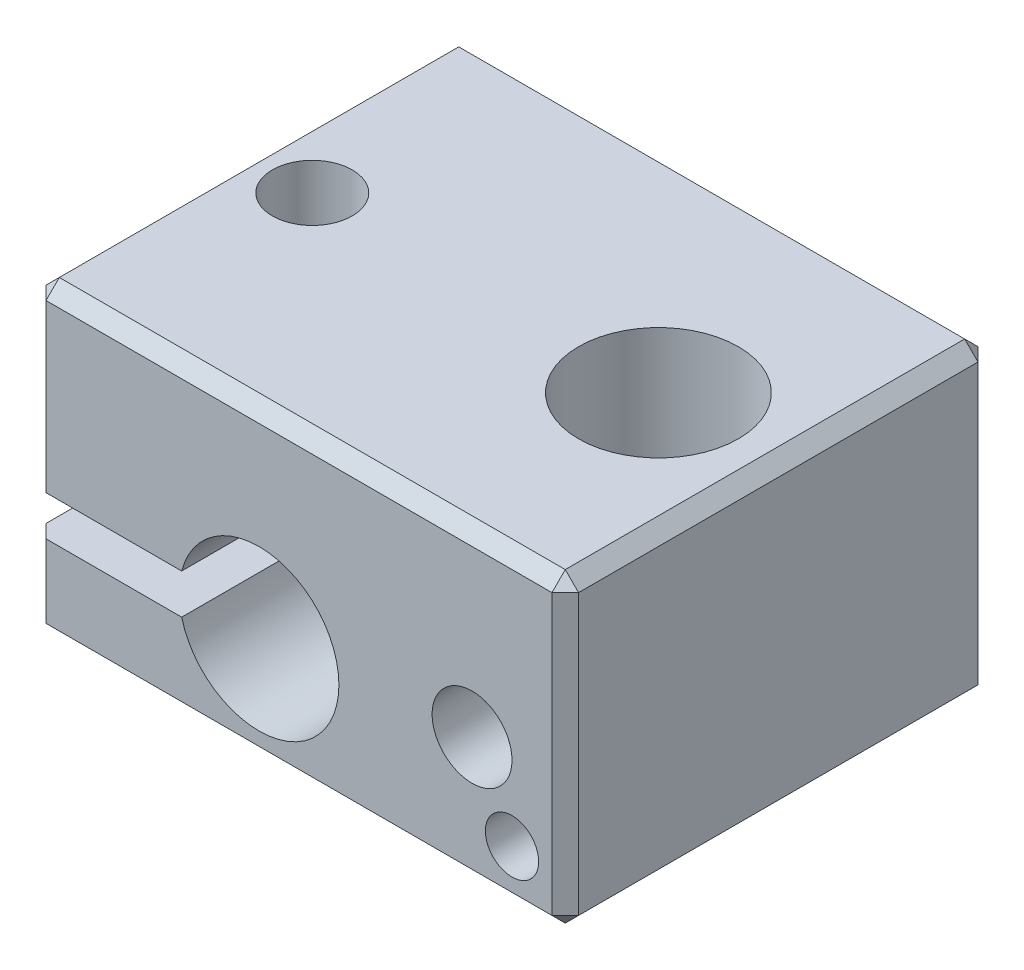
ISO-10303-21;
HEADER;
FILE_DESCRIPTION(('STEP AP214'),'2;1');
FILE_NAME('part.step','',(''),(''),'','','');
FILE_SCHEMA(('AUTOMOTIVE_DESIGN { 1 0 10303 214 1 1 1 1 }'));
ENDSEC;
DATA;
#1=APPLICATION_CONTEXT('core data for automotive mechanical design processes');
#2=APPLICATION_PROTOCOL_DEFINITION('international standard','automotive_design',2000,#1);
#3=PRODUCT_CONTEXT('',#1,'mechanical');
#4=PRODUCT('Part','Part','',(#3));
#5=PRODUCT_RELATED_PRODUCT_CATEGORY('part','',(#4));
#6=PRODUCT_DEFINITION_FORMATION('','',#4);
#7=PRODUCT_DEFINITION_CONTEXT('part definition',#1,'design');
#8=PRODUCT_DEFINITION('design','',#6,#7);
#9=PRODUCT_DEFINITION_SHAPE('','',#8);
#10=(LENGTH_UNIT() NAMED_UNIT(*) SI_UNIT(.MILLI.,.METRE.));
#11=(NAMED_UNIT(*) PLANE_ANGLE_UNIT() SI_UNIT($,.RADIAN.));
#12=(NAMED_UNIT(*) SI_UNIT($,.STERADIAN.) SOLID_ANGLE_UNIT());
#13=UNCERTAINTY_MEASURE_WITH_UNIT(LENGTH_MEASURE(1.E-05),#10,'distance_accuracy_value','');
#14=(GEOMETRIC_REPRESENTATION_CONTEXT(3) GLOBAL_UNCERTAINTY_ASSIGNED_CONTEXT((#13)) GLOBAL_UNIT_ASSIGNED_CONTEXT((#10,
#11,#12)) REPRESENTATION_CONTEXT('',''));
#15=CARTESIAN_POINT('',(0.,0.,0.));
#16=DIRECTION('',(0.,0.,1.));
#17=DIRECTION('',(1.,0.,0.));
#18=AXIS2_PLACEMENT_3D('',#15,#16,#17);
#19=CARTESIAN_POINT('',(-10.,11.5,8.));
#20=DIRECTION('',(1.,0.,0.));
#21=DIRECTION('',(0.,0.,-1.));
#22=AXIS2_PLACEMENT_3D('',#19,#20,#21);
#23=PLANE('',#22);
#24=DIRECTION('',(0.,0.,-1.));
#25=VECTOR('',#24,1.);
#26=CARTESIAN_POINT('',(-10.,11.,8.));
#27=LINE('',#26,#25);
#28=CARTESIAN_POINT('',(-10.,11.,7.5));
#29=VERTEX_POINT('',#28);
#30=CARTESIAN_POINT('',(-10.,11.,-7.5));
#31=VERTEX_POINT('',#30);
#32=EDGE_CURVE('E243',#29,#31,#27,.T.);
#33=ORIENTED_EDGE('',*,*,#32,.T.);
#34=DIRECTION('',(0.,-1.,0.));
#35=VECTOR('',#34,1.);
#36=CARTESIAN_POINT('',(-10.,11.5,-7.5));
#37=LINE('',#36,#35);
#38=CARTESIAN_POINT('',(-10.,4.75,-7.5));
#39=VERTEX_POINT('',#38);
#40=EDGE_CURVE('E247',#31,#39,#37,.T.);
#41=ORIENTED_EDGE('',*,*,#40,.T.);
#42=DIRECTION('',(0.,0.,1.));
#43=VECTOR('',#42,1.);
#44=CARTESIAN_POINT('',(-10.,4.75,-8.));
#45=LINE('',#44,#43);
#46=CARTESIAN_POINT('',(-10.,4.75,7.5));
#47=VERTEX_POINT('',#46);
#48=EDGE_CURVE('E194',#39,#47,#45,.T.);
#49=ORIENTED_EDGE('',*,*,#48,.T.);
#50=DIRECTION('',(0.,1.,0.));
#51=VECTOR('',#50,1.);
#52=CARTESIAN_POINT('',(-10.,11.5,7.5));
#53=LINE('',#52,#51);
#54=EDGE_CURVE('E245',#47,#29,#53,.T.);
#55=ORIENTED_EDGE('',*,*,#54,.T.);
#56=EDGE_LOOP('',(#33,#41,#49,#55));
#57=FACE_BOUND('',#56,.T.);
#58=ADVANCED_FACE('F35',(#57),#23,.F.);
#59=CARTESIAN_POINT('',(10.,11.5,8.));
#60=DIRECTION('',(-1.,0.,0.));
#61=DIRECTION('',(0.,0.,1.));
#62=AXIS2_PLACEMENT_3D('',#59,#60,#61);
#63=PLANE('',#62);
#64=DIRECTION('',(0.,0.,-1.));
#65=VECTOR('',#64,1.);
#66=CARTESIAN_POINT('',(10.,0.5,-8.));
#67=LINE('',#66,#65);
#68=CARTESIAN_POINT('',(10.,0.5,7.5));
#69=VERTEX_POINT('',#68);
#70=CARTESIAN_POINT('',(10.,0.5,-7.5));
#71=VERTEX_POINT('',#70);
#72=EDGE_CURVE('E219',#69,#71,#67,.T.);
#73=ORIENTED_EDGE('',*,*,#72,.T.);
#74=DIRECTION('',(0.,1.,0.));
#75=VECTOR('',#74,1.);
#76=CARTESIAN_POINT('',(10.,11.5,-7.5));
#77=LINE('',#76,#75);
#78=CARTESIAN_POINT('',(10.,11.,-7.5));
#79=VERTEX_POINT('',#78);
#80=EDGE_CURVE('E221',#71,#79,#77,.T.);
#81=ORIENTED_EDGE('',*,*,#80,.T.);
#82=DIRECTION('',(0.,0.,1.));
#83=VECTOR('',#82,1.);
#84=CARTESIAN_POINT('',(10.,11.,8.));
#85=LINE('',#84,#83);
#86=CARTESIAN_POINT('',(10.,11.,7.5));
#87=VERTEX_POINT('',#86);
#88=EDGE_CURVE('E217',#79,#87,#85,.T.);
#89=ORIENTED_EDGE('',*,*,#88,.T.);
#90=DIRECTION('',(0.,-1.,0.));
#91=VECTOR('',#90,1.);
#92=CARTESIAN_POINT('',(10.,11.5,7.5));
#93=LINE('',#92,#91);
#94=EDGE_CURVE('E215',#87,#69,#93,.T.);
#95=ORIENTED_EDGE('',*,*,#94,.T.);
#96=EDGE_LOOP('',(#73,#81,#89,#95));
#97=FACE_BOUND('',#96,.T.);
#98=ADVANCED_FACE('F405',(#97),#63,.F.);
#99=CARTESIAN_POINT('',(-10.,11.5,-8.));
#100=DIRECTION('',(0.,0.,1.));
#101=DIRECTION('',(1.,0.,0.));
#102=AXIS2_PLACEMENT_3D('',#99,#100,#101);
#103=PLANE('',#102);
#104=DIRECTION('',(-1.,0.,0.));
#105=VECTOR('',#104,1.);
#106=CARTESIAN_POINT('',(-10.,0.5,-8.));
#107=LINE('',#106,#105);
#108=CARTESIAN_POINT('',(9.5,0.5,-8.));
#109=VERTEX_POINT('',#108);
#110=CARTESIAN_POINT('',(-9.5,0.5,-8.));
#111=VERTEX_POINT('',#110);
#112=EDGE_CURVE('E211',#109,#111,#107,.T.);
#113=ORIENTED_EDGE('',*,*,#112,.T.);
#114=DIRECTION('',(0.,1.,0.));
#115=VECTOR('',#114,1.);
#116=CARTESIAN_POINT('',(-9.5,11.5,-8.));
#117=LINE('',#116,#115);
#118=CARTESIAN_POINT('',(-9.5,3.25,-8.));
#119=VERTEX_POINT('',#118);
#120=EDGE_CURVE('E213',#111,#119,#117,.T.);
#121=ORIENTED_EDGE('',*,*,#120,.T.);
#122=DIRECTION('',(1.,0.,0.));
#123=VECTOR('',#122,1.);
#124=CARTESIAN_POINT('',(-10.,3.25,-8.));
#125=LINE('',#124,#123);
#126=CARTESIAN_POINT('',(-4.40473750965556,3.25,-8.));
#127=VERTEX_POINT('',#126);
#128=EDGE_CURVE('E180',#119,#127,#125,.T.);
#129=ORIENTED_EDGE('',*,*,#128,.T.);
#130=CARTESIAN_POINT('',(-1.5,4.,-8.));
#131=DIRECTION('',(0.,0.,1.));
#132=DIRECTION('',(1.,0.,0.));
#133=AXIS2_PLACEMENT_3D('',#130,#131,#132);
#134=CIRCLE('',#133,3.);
#135=CARTESIAN_POINT('',(-4.40473750965556,4.75,-8.));
#136=VERTEX_POINT('',#135);
#137=EDGE_CURVE('E182',#127,#136,#134,.T.);
#138=ORIENTED_EDGE('',*,*,#137,.T.);
#139=DIRECTION('',(-1.,0.,0.));
#140=VECTOR('',#139,1.);
#141=CARTESIAN_POINT('',(-4.40473750965556,4.75,-8.));
#142=LINE('',#141,#140);
#143=CARTESIAN_POINT('',(-9.5,4.75,-8.));
#144=VERTEX_POINT('',#143);
#145=EDGE_CURVE('E186',#136,#144,#142,.T.);
#146=ORIENTED_EDGE('',*,*,#145,.T.);
#147=DIRECTION('',(0.,1.,0.));
#148=VECTOR('',#147,1.);
#149=CARTESIAN_POINT('',(-9.5,11.5,-8.));
#150=LINE('',#149,#148);
#151=CARTESIAN_POINT('',(-9.5,11.,-8.));
#152=VERTEX_POINT('',#151);
#153=EDGE_CURVE('E206',#144,#152,#150,.T.);
#154=ORIENTED_EDGE('',*,*,#153,.T.);
#155=DIRECTION('',(1.,0.,0.));
#156=VECTOR('',#155,1.);
#157=CARTESIAN_POINT('',(-10.,11.,-8.));
#158=LINE('',#157,#156);
#159=CARTESIAN_POINT('',(9.5,11.,-8.));
#160=VERTEX_POINT('',#159);
#161=EDGE_CURVE('E197',#152,#160,#158,.T.);
#162=ORIENTED_EDGE('',*,*,#161,.T.);
#163=DIRECTION('',(0.,-1.,0.));
#164=VECTOR('',#163,1.);
#165=CARTESIAN_POINT('',(9.5,11.5,-8.));
#166=LINE('',#165,#164);
#167=EDGE_CURVE('E208',#160,#109,#166,.T.);
#168=ORIENTED_EDGE('',*,*,#167,.T.);
#169=EDGE_LOOP('',(#113,#121,#129,#138,#146,#154,#162,#168));
#170=FACE_BOUND('',#169,.T.);
#171=ADVANCED_FACE('F399',(#170),#103,.F.);
#172=DIRECTION('',(0.,0.,1.));
#173=VECTOR('',#172,1.);
#174=CARTESIAN_POINT('',(-10.,3.25,-8.));
#175=LINE('',#174,#173);
#176=CARTESIAN_POINT('',(-10.,3.25,-7.5));
#177=VERTEX_POINT('',#176);
#178=CARTESIAN_POINT('',(-10.,3.25,7.5));
#179=VERTEX_POINT('',#178);
#180=EDGE_CURVE('E188',#177,#179,#175,.T.);
#181=ORIENTED_EDGE('',*,*,#180,.F.);
#182=DIRECTION('',(0.,-1.,0.));
#183=VECTOR('',#182,1.);
#184=CARTESIAN_POINT('',(-10.,11.5,-7.5));
#185=LINE('',#184,#183);
#186=CARTESIAN_POINT('',(-10.,0.5,-7.5));
#187=VERTEX_POINT('',#186);
#188=EDGE_CURVE('E237',#177,#187,#185,.T.);
#189=ORIENTED_EDGE('',*,*,#188,.T.);
#190=DIRECTION('',(0.,0.,1.));
#191=VECTOR('',#190,1.);
#192=CARTESIAN_POINT('',(-10.,0.5,8.));
#193=LINE('',#192,#191);
#194=CARTESIAN_POINT('',(-10.,0.5,7.5));
#195=VERTEX_POINT('',#194);
#196=EDGE_CURVE('E235',#187,#195,#193,.T.);
#197=ORIENTED_EDGE('',*,*,#196,.T.);
#198=DIRECTION('',(0.,1.,0.));
#199=VECTOR('',#198,1.);
#200=CARTESIAN_POINT('',(-10.,11.5,7.5));
#201=LINE('',#200,#199);
#202=EDGE_CURVE('E233',#195,#179,#201,.T.);
#203=ORIENTED_EDGE('',*,*,#202,.T.);
#204=EDGE_LOOP('',(#181,#189,#197,#203));
#205=FACE_BOUND('',#204,.T.);
#206=ADVANCED_FACE('F390',(#205),#23,.F.);
#207=CARTESIAN_POINT('',(-10.,11.5,8.));
#208=DIRECTION('',(0.,0.,-1.));
#209=DIRECTION('',(-1.,0.,0.));
#210=AXIS2_PLACEMENT_3D('',#207,#208,#209);
#211=PLANE('',#210);
#212=DIRECTION('',(1.,0.,0.));
#213=VECTOR('',#212,1.);
#214=CARTESIAN_POINT('',(-10.,3.25,8.));
#215=LINE('',#214,#213);
#216=CARTESIAN_POINT('',(-9.5,3.25,8.));
#217=VERTEX_POINT('',#216);
#218=CARTESIAN_POINT('',(-4.40473750965556,3.25,8.));
#219=VERTEX_POINT('',#218);
#220=EDGE_CURVE('E170',#217,#219,#215,.T.);
#221=ORIENTED_EDGE('',*,*,#220,.F.);
#222=DIRECTION('',(0.,-1.,0.));
#223=VECTOR('',#222,1.);
#224=CARTESIAN_POINT('',(-9.5,11.5,8.));
#225=LINE('',#224,#223);
#226=CARTESIAN_POINT('',(-9.5,0.5,8.));
#227=VERTEX_POINT('',#226);
#228=EDGE_CURVE('E11',#217,#227,#225,.T.);
#229=ORIENTED_EDGE('',*,*,#228,.T.);
#230=DIRECTION('',(1.,0.,0.));
#231=VECTOR('',#230,1.);
#232=CARTESIAN_POINT('',(10.,0.5,8.));
#233=LINE('',#232,#231);
#234=CARTESIAN_POINT('',(9.5,0.5,8.));
#235=VERTEX_POINT('',#234);
#236=EDGE_CURVE('E44',#227,#235,#233,.T.);
#237=ORIENTED_EDGE('',*,*,#236,.T.);
#238=DIRECTION('',(0.,1.,0.));
#239=VECTOR('',#238,1.);
#240=CARTESIAN_POINT('',(9.5,11.5,8.));
#241=LINE('',#240,#239);
#242=CARTESIAN_POINT('',(9.5,11.,8.));
#243=VERTEX_POINT('',#242);
#244=EDGE_CURVE('E266',#235,#243,#241,.T.);
#245=ORIENTED_EDGE('',*,*,#244,.T.);
#246=DIRECTION('',(-1.,0.,0.));
#247=VECTOR('',#246,1.);
#248=CARTESIAN_POINT('',(-10.,11.,8.));
#249=LINE('',#248,#247);
#250=CARTESIAN_POINT('',(-9.5,11.,8.));
#251=VERTEX_POINT('',#250);
#252=EDGE_CURVE('E262',#243,#251,#249,.T.);
#253=ORIENTED_EDGE('',*,*,#252,.T.);
#254=DIRECTION('',(0.,-1.,0.));
#255=VECTOR('',#254,1.);
#256=CARTESIAN_POINT('',(-9.5,11.5,8.));
#257=LINE('',#256,#255);
#258=CARTESIAN_POINT('',(-9.5,4.75,8.));
#259=VERTEX_POINT('',#258);
#260=EDGE_CURVE('E264',#251,#259,#257,.T.);
#261=ORIENTED_EDGE('',*,*,#260,.T.);
#262=DIRECTION('',(-1.,0.,0.));
#263=VECTOR('',#262,1.);
#264=CARTESIAN_POINT('',(-4.40473750965556,4.75,8.));
#265=LINE('',#264,#263);
#266=CARTESIAN_POINT('',(-4.40473750965556,4.75,8.));
#267=VERTEX_POINT('',#266);
#268=EDGE_CURVE('E183',#267,#259,#265,.T.);
#269=ORIENTED_EDGE('',*,*,#268,.F.);
#270=CARTESIAN_POINT('',(-1.5,4.,8.));
#271=DIRECTION('',(0.,0.,1.));
#272=DIRECTION('',(1.,0.,0.));
#273=AXIS2_PLACEMENT_3D('',#270,#271,#272);
#274=CIRCLE('',#273,3.);
#275=EDGE_CURVE('E173',#219,#267,#274,.T.);
#276=ORIENTED_EDGE('',*,*,#275,.F.);
#277=EDGE_LOOP('',(#221,#229,#237,#245,#253,#261,#269,#276));
#278=FACE_BOUND('',#277,.T.);
#279=CARTESIAN_POINT('',(8.,2.,8.));
#280=DIRECTION('',(0.,0.,1.));
#281=DIRECTION('',(1.,0.,0.));
#282=AXIS2_PLACEMENT_3D('',#279,#280,#281);
#283=CIRCLE('',#282,1.00000000000001);
#284=CARTESIAN_POINT('',(9.00000000000002,2.,8.));
#285=VERTEX_POINT('',#284);
#286=EDGE_CURVE('E361',#285,#285,#283,.T.);
#287=ORIENTED_EDGE('',*,*,#286,.F.);
#288=EDGE_LOOP('',(#287));
#289=FACE_BOUND('',#288,.T.);
#290=CARTESIAN_POINT('',(6.5,4.8,8.));
#291=DIRECTION('',(0.,0.,1.));
#292=DIRECTION('',(1.,0.,0.));
#293=AXIS2_PLACEMENT_3D('',#290,#291,#292);
#294=CIRCLE('',#293,1.49999999999999);
#295=CARTESIAN_POINT('',(7.99999999999999,4.8,8.));
#296=VERTEX_POINT('',#295);
#297=EDGE_CURVE('E373',#296,#296,#294,.T.);
#298=ORIENTED_EDGE('',*,*,#297,.F.);
#299=EDGE_LOOP('',(#298));
#300=FACE_BOUND('',#299,.T.);
#301=ADVANCED_FACE('F387',(#278,#289,#300),#211,.F.);
#302=CARTESIAN_POINT('',(0.,11.5,0.));
#303=DIRECTION('',(0.,-1.,0.));
#304=DIRECTION('',(0.,0.,-1.));
#305=AXIS2_PLACEMENT_3D('',#302,#303,#304);
#306=PLANE('',#305);
#307=DIRECTION('',(0.,0.,-1.));
#308=VECTOR('',#307,1.);
#309=CARTESIAN_POINT('',(9.5,11.5,0.));
#310=LINE('',#309,#308);
#311=CARTESIAN_POINT('',(9.5,11.5,7.5));
#312=VERTEX_POINT('',#311);
#313=CARTESIAN_POINT('',(9.5,11.5,-7.5));
#314=VERTEX_POINT('',#313);
#315=EDGE_CURVE('E257',#312,#314,#310,.T.);
#316=ORIENTED_EDGE('',*,*,#315,.T.);
#317=DIRECTION('',(-1.,0.,0.));
#318=VECTOR('',#317,1.);
#319=CARTESIAN_POINT('',(0.,11.5,-7.5));
#320=LINE('',#319,#318);
#321=CARTESIAN_POINT('',(-9.5,11.5,-7.5));
#322=VERTEX_POINT('',#321);
#323=EDGE_CURVE('E259',#314,#322,#320,.T.);
#324=ORIENTED_EDGE('',*,*,#323,.T.);
#325=DIRECTION('',(0.,0.,1.));
#326=VECTOR('',#325,1.);
#327=CARTESIAN_POINT('',(-9.5,11.5,0.));
#328=LINE('',#327,#326);
#329=CARTESIAN_POINT('',(-9.5,11.5,7.5));
#330=VERTEX_POINT('',#329);
#331=EDGE_CURVE('E253',#322,#330,#328,.T.);
#332=ORIENTED_EDGE('',*,*,#331,.T.);
#333=DIRECTION('',(1.,0.,0.));
#334=VECTOR('',#333,1.);
#335=CARTESIAN_POINT('',(0.,11.5,7.5));
#336=LINE('',#335,#334);
#337=EDGE_CURVE('E255',#330,#312,#336,.T.);
#338=ORIENTED_EDGE('',*,*,#337,.T.);
#339=EDGE_LOOP('',(#316,#324,#332,#338));
#340=FACE_BOUND('',#339,.T.);
#341=CARTESIAN_POINT('',(-7.5,11.5,0.));
#342=DIRECTION('',(0.,1.,0.));
#343=DIRECTION('',(0.,0.,1.));
#344=AXIS2_PLACEMENT_3D('',#341,#342,#343);
#345=CIRCLE('',#344,1.49999999999999);
#346=CARTESIAN_POINT('',(-7.5,11.5,1.49999999999999));
#347=VERTEX_POINT('',#346);
#348=EDGE_CURVE('E336',#347,#347,#345,.T.);
#349=ORIENTED_EDGE('',*,*,#348,.F.);
#350=EDGE_LOOP('',(#349));
#351=FACE_BOUND('',#350,.T.);
#352=CARTESIAN_POINT('',(5.5,11.5,0.));
#353=DIRECTION('',(0.,1.,0.));
#354=DIRECTION('',(0.,0.,1.));
#355=AXIS2_PLACEMENT_3D('',#352,#353,#354);
#356=CIRCLE('',#355,2.99999999999999);
#357=CARTESIAN_POINT('',(5.5,11.5,2.99999999999999));
#358=VERTEX_POINT('',#357);
#359=EDGE_CURVE('E355',#358,#358,#356,.T.);
#360=ORIENTED_EDGE('',*,*,#359,.F.);
#361=EDGE_LOOP('',(#360));
#362=FACE_BOUND('',#361,.T.);
#363=ADVANCED_FACE('F389',(#340,#351,#362),#306,.F.);
#364=CARTESIAN_POINT('',(0.,0.,0.));
#365=DIRECTION('',(0.,-1.,0.));
#366=DIRECTION('',(0.,0.,-1.));
#367=AXIS2_PLACEMENT_3D('',#364,#365,#366);
#368=PLANE('',#367);
#369=DIRECTION('',(0.,0.,-1.));
#370=VECTOR('',#369,1.);
#371=CARTESIAN_POINT('',(-9.5,0.,-8.));
#372=LINE('',#371,#370);
#373=CARTESIAN_POINT('',(-9.5,0.,7.5));
#374=VERTEX_POINT('',#373);
#375=CARTESIAN_POINT('',(-9.5,0.,-7.5));
#376=VERTEX_POINT('',#375);
#377=EDGE_CURVE('E226',#374,#376,#372,.T.);
#378=ORIENTED_EDGE('',*,*,#377,.T.);
#379=DIRECTION('',(1.,0.,0.));
#380=VECTOR('',#379,1.);
#381=CARTESIAN_POINT('',(10.,0.,-7.5));
#382=LINE('',#381,#380);
#383=CARTESIAN_POINT('',(9.5,0.,-7.5));
#384=VERTEX_POINT('',#383);
#385=EDGE_CURVE('E230',#376,#384,#382,.T.);
#386=ORIENTED_EDGE('',*,*,#385,.T.);
#387=DIRECTION('',(0.,0.,1.));
#388=VECTOR('',#387,1.);
#389=CARTESIAN_POINT('',(9.5,0.,8.));
#390=LINE('',#389,#388);
#391=CARTESIAN_POINT('',(9.5,0.,7.5));
#392=VERTEX_POINT('',#391);
#393=EDGE_CURVE('E228',#384,#392,#390,.T.);
#394=ORIENTED_EDGE('',*,*,#393,.T.);
#395=DIRECTION('',(-1.,0.,0.));
#396=VECTOR('',#395,1.);
#397=CARTESIAN_POINT('',(-10.,0.,7.5));
#398=LINE('',#397,#396);
#399=EDGE_CURVE('E224',#392,#374,#398,.T.);
#400=ORIENTED_EDGE('',*,*,#399,.T.);
#401=EDGE_LOOP('',(#378,#386,#394,#400));
#402=FACE_BOUND('',#401,.T.);
#403=CARTESIAN_POINT('',(-7.5,0.,0.));
#404=DIRECTION('',(0.,1.,0.));
#405=DIRECTION('',(0.,0.,1.));
#406=AXIS2_PLACEMENT_3D('',#403,#404,#405);
#407=CIRCLE('',#406,1.5);
#408=CARTESIAN_POINT('',(-7.5,0.,1.5));
#409=VERTEX_POINT('',#408);
#410=EDGE_CURVE('E342',#409,#409,#407,.T.);
#411=ORIENTED_EDGE('',*,*,#410,.T.);
#412=EDGE_LOOP('',(#411));
#413=FACE_BOUND('',#412,.T.);
#414=CARTESIAN_POINT('',(5.5,0.,0.));
#415=DIRECTION('',(0.,1.,0.));
#416=DIRECTION('',(0.,0.,1.));
#417=AXIS2_PLACEMENT_3D('',#414,#415,#416);
#418=CIRCLE('',#417,3.);
#419=CARTESIAN_POINT('',(5.5,0.,3.));
#420=VERTEX_POINT('',#419);
#421=EDGE_CURVE('E358',#420,#420,#418,.T.);
#422=ORIENTED_EDGE('',*,*,#421,.T.);
#423=EDGE_LOOP('',(#422));
#424=FACE_BOUND('',#423,.T.);
#425=ADVANCED_FACE('F396',(#402,#413,#424),#368,.T.);
#426=CARTESIAN_POINT('',(-4.40473750965556,4.75,-8.));
#427=DIRECTION('',(0.,1.,0.));
#428=DIRECTION('',(0.,0.,1.));
#429=AXIS2_PLACEMENT_3D('',#426,#427,#428);
#430=PLANE('',#429);
#431=CARTESIAN_POINT('',(-7.5,4.75,0.));
#432=DIRECTION('',(0.,1.,0.));
#433=DIRECTION('',(0.,0.,1.));
#434=AXIS2_PLACEMENT_3D('',#431,#432,#433);
#435=CIRCLE('',#434,1.49999999999999);
#436=CARTESIAN_POINT('',(-7.5,4.75,1.49999999999999));
#437=VERTEX_POINT('',#436);
#438=EDGE_CURVE('E352',#437,#437,#435,.T.);
#439=ORIENTED_EDGE('',*,*,#438,.T.);
#440=EDGE_LOOP('',(#439));
#441=FACE_BOUND('',#440,.T.);
#442=ORIENTED_EDGE('',*,*,#48,.F.);
#443=DIRECTION('',(-0.707106781186548,0.,0.707106781186548));
#444=VECTOR('',#443,1.);
#445=CARTESIAN_POINT('',(-10.,4.75,-7.5));
#446=LINE('',#445,#444);
#447=EDGE_CURVE('E251',#39,#144,#446,.F.);
#448=ORIENTED_EDGE('',*,*,#447,.T.);
#449=ORIENTED_EDGE('',*,*,#145,.F.);
#450=DIRECTION('',(0.,0.,1.));
#451=VECTOR('',#450,1.);
#452=CARTESIAN_POINT('',(-4.40473750965556,4.75,-8.));
#453=LINE('',#452,#451);
#454=EDGE_CURVE('E198',#136,#267,#453,.T.);
#455=ORIENTED_EDGE('',*,*,#454,.T.);
#456=ORIENTED_EDGE('',*,*,#268,.T.);
#457=DIRECTION('',(0.707106781186548,0.,0.707106781186548));
#458=VECTOR('',#457,1.);
#459=CARTESIAN_POINT('',(-9.5,4.75,8.));
#460=LINE('',#459,#458);
#461=EDGE_CURVE('E249',#259,#47,#460,.F.);
#462=ORIENTED_EDGE('',*,*,#461,.T.);
#463=EDGE_LOOP('',(#442,#448,#449,#455,#456,#462));
#464=FACE_BOUND('',#463,.T.);
#465=ADVANCED_FACE('F544',(#441,#464),#430,.F.);
#466=CARTESIAN_POINT('',(-1.5,4.,-8.));
#467=DIRECTION('',(0.,0.,1.));
#468=DIRECTION('',(1.,0.,0.));
#469=AXIS2_PLACEMENT_3D('',#466,#467,#468);
#470=CYLINDRICAL_SURFACE('',#469,3.);
#471=ORIENTED_EDGE('',*,*,#275,.T.);
#472=ORIENTED_EDGE('',*,*,#454,.F.);
#473=ORIENTED_EDGE('',*,*,#137,.F.);
#474=DIRECTION('',(0.,0.,1.));
#475=VECTOR('',#474,1.);
#476=CARTESIAN_POINT('',(-4.40473750965556,3.25,-8.));
#477=LINE('',#476,#475);
#478=EDGE_CURVE('E200',#127,#219,#477,.T.);
#479=ORIENTED_EDGE('',*,*,#478,.T.);
#480=EDGE_LOOP('',(#471,#472,#473,#479));
#481=FACE_BOUND('',#480,.T.);
#482=ADVANCED_FACE('F510',(#481),#470,.F.);
#483=CARTESIAN_POINT('',(-10.,3.25,-8.));
#484=DIRECTION('',(0.,-1.,0.));
#485=DIRECTION('',(1.,0.,0.));
#486=AXIS2_PLACEMENT_3D('',#483,#484,#485);
#487=PLANE('',#486);
#488=CARTESIAN_POINT('',(-7.5,3.25,0.));
#489=DIRECTION('',(0.,-1.,0.));
#490=DIRECTION('',(1.,0.,0.));
#491=AXIS2_PLACEMENT_3D('',#488,#489,#490);
#492=CIRCLE('',#491,1.49999999999999);
#493=CARTESIAN_POINT('',(-6.00000000000001,3.25,0.));
#494=VERTEX_POINT('',#493);
#495=EDGE_CURVE('E347',#494,#494,#492,.T.);
#496=ORIENTED_EDGE('',*,*,#495,.T.);
#497=EDGE_LOOP('',(#496));
#498=FACE_BOUND('',#497,.T.);
#499=ORIENTED_EDGE('',*,*,#128,.F.);
#500=DIRECTION('',(0.707106781186548,0.,-0.707106781186548));
#501=VECTOR('',#500,1.);
#502=CARTESIAN_POINT('',(-10.,3.25,-7.5));
#503=LINE('',#502,#501);
#504=EDGE_CURVE('E241',#119,#177,#503,.F.);
#505=ORIENTED_EDGE('',*,*,#504,.T.);
#506=ORIENTED_EDGE('',*,*,#180,.T.);
#507=DIRECTION('',(-0.707106781186548,0.,-0.707106781186548));
#508=VECTOR('',#507,1.);
#509=CARTESIAN_POINT('',(-9.5,3.25,8.));
#510=LINE('',#509,#508);
#511=EDGE_CURVE('E239',#179,#217,#510,.F.);
#512=ORIENTED_EDGE('',*,*,#511,.T.);
#513=ORIENTED_EDGE('',*,*,#220,.T.);
#514=ORIENTED_EDGE('',*,*,#478,.F.);
#515=EDGE_LOOP('',(#499,#505,#506,#512,#513,#514));
#516=FACE_BOUND('',#515,.T.);
#517=ADVANCED_FACE('F164',(#498,#516),#487,.F.);
#518=CARTESIAN_POINT('',(6.5,4.8,4.5));
#519=DIRECTION('',(0.,0.,1.));
#520=DIRECTION('',(1.,0.,0.));
#521=AXIS2_PLACEMENT_3D('',#518,#519,#520);
#522=CONICAL_SURFACE('',#521,1.25,1.02974425867666);
#523=CARTESIAN_POINT('',(6.5,4.8,3.74892422621555));
#524=VERTEX_POINT('',#523);
#525=VERTEX_LOOP('',#524);
#526=FACE_BOUND('',#525,.T.);
#527=CARTESIAN_POINT('',(6.5,4.8,4.5));
#528=DIRECTION('',(0.,0.,1.));
#529=DIRECTION('',(1.,0.,0.));
#530=AXIS2_PLACEMENT_3D('',#527,#528,#529);
#531=CIRCLE('',#530,1.25);
#532=CARTESIAN_POINT('',(7.75,4.8,4.5));
#533=VERTEX_POINT('',#532);
#534=EDGE_CURVE('E168',#533,#533,#531,.T.);
#535=ORIENTED_EDGE('',*,*,#534,.T.);
#536=EDGE_LOOP('',(#535));
#537=FACE_BOUND('',#536,.T.);
#538=ADVANCED_FACE('F160',(#526,#537),#522,.F.);
#539=CARTESIAN_POINT('',(6.5,4.8,8.));
#540=DIRECTION('',(0.,0.,1.));
#541=DIRECTION('',(1.,0.,0.));
#542=AXIS2_PLACEMENT_3D('',#539,#540,#541);
#543=CYLINDRICAL_SURFACE('',#542,1.25);
#544=ORIENTED_EDGE('',*,*,#534,.F.);
#545=EDGE_LOOP('',(#544));
#546=FACE_BOUND('',#545,.T.);
#547=CARTESIAN_POINT('',(6.5,4.8,5.));
#548=DIRECTION('',(0.,0.,1.));
#549=DIRECTION('',(1.,0.,0.));
#550=AXIS2_PLACEMENT_3D('',#547,#548,#549);
#551=CIRCLE('',#550,1.25);
#552=CARTESIAN_POINT('',(7.75,4.8,5.));
#553=VERTEX_POINT('',#552);
#554=EDGE_CURVE('E171',#553,#553,#551,.T.);
#555=ORIENTED_EDGE('',*,*,#554,.T.);
#556=EDGE_LOOP('',(#555));
#557=FACE_BOUND('',#556,.T.);
#558=ADVANCED_FACE('F163',(#546,#557),#543,.F.);
#559=CARTESIAN_POINT('',(7.75,4.8,5.));
#560=DIRECTION('',(0.,0.,-1.));
#561=DIRECTION('',(-1.,0.,0.));
#562=AXIS2_PLACEMENT_3D('',#559,#560,#561);
#563=PLANE('',#562);
#564=ORIENTED_EDGE('',*,*,#554,.F.);
#565=EDGE_LOOP('',(#564));
#566=FACE_BOUND('',#565,.T.);
#567=CARTESIAN_POINT('',(6.5,4.8,5.));
#568=DIRECTION('',(0.,0.,1.));
#569=DIRECTION('',(1.,0.,0.));
#570=AXIS2_PLACEMENT_3D('',#567,#568,#569);
#571=CIRCLE('',#570,1.5);
#572=CARTESIAN_POINT('',(8.,4.8,5.));
#573=VERTEX_POINT('',#572);
#574=EDGE_CURVE('E176',#573,#573,#571,.T.);
#575=ORIENTED_EDGE('',*,*,#574,.T.);
#576=EDGE_LOOP('',(#575));
#577=FACE_BOUND('',#576,.T.);
#578=ADVANCED_FACE('F378',(#566,#577),#563,.F.);
#579=CARTESIAN_POINT('',(6.5,4.8,8.));
#580=DIRECTION('',(0.,0.,1.));
#581=DIRECTION('',(1.,0.,0.));
#582=AXIS2_PLACEMENT_3D('',#579,#580,#581);
#583=CYLINDRICAL_SURFACE('',#582,1.5);
#584=ORIENTED_EDGE('',*,*,#574,.F.);
#585=EDGE_LOOP('',(#584));
#586=FACE_BOUND('',#585,.T.);
#587=ORIENTED_EDGE('',*,*,#297,.T.);
#588=EDGE_LOOP('',(#587));
#589=FACE_BOUND('',#588,.T.);
#590=ADVANCED_FACE('F380',(#586,#589),#583,.F.);
#591=CARTESIAN_POINT('',(8.,2.,3.5));
#592=DIRECTION('',(0.,0.,-1.));
#593=DIRECTION('',(-1.,0.,0.));
#594=AXIS2_PLACEMENT_3D('',#591,#592,#593);
#595=PLANE('',#594);
#596=CARTESIAN_POINT('',(8.,2.,3.5));
#597=DIRECTION('',(0.,0.,1.));
#598=DIRECTION('',(1.,0.,0.));
#599=AXIS2_PLACEMENT_3D('',#596,#597,#598);
#600=CIRCLE('',#599,0.750000000000013);
#601=CARTESIAN_POINT('',(8.75000000000001,2.,3.5));
#602=VERTEX_POINT('',#601);
#603=EDGE_CURVE('E370',#602,#602,#600,.T.);
#604=ORIENTED_EDGE('',*,*,#603,.T.);
#605=EDGE_LOOP('',(#604));
#606=FACE_BOUND('',#605,.T.);
#607=ADVANCED_FACE('F383',(#606),#595,.F.);
#608=CARTESIAN_POINT('',(8.,2.,8.));
#609=DIRECTION('',(0.,0.,1.));
#610=DIRECTION('',(1.,0.,0.));
#611=AXIS2_PLACEMENT_3D('',#608,#609,#610);
#612=CYLINDRICAL_SURFACE('',#611,0.750000000000014);
#613=ORIENTED_EDGE('',*,*,#603,.F.);
#614=EDGE_LOOP('',(#613));
#615=FACE_BOUND('',#614,.T.);
#616=CARTESIAN_POINT('',(8.,2.,6.));
#617=DIRECTION('',(0.,0.,1.));
#618=DIRECTION('',(1.,0.,0.));
#619=AXIS2_PLACEMENT_3D('',#616,#617,#618);
#620=CIRCLE('',#619,0.750000000000015);
#621=CARTESIAN_POINT('',(8.75000000000002,2.,6.));
#622=VERTEX_POINT('',#621);
#623=EDGE_CURVE('E367',#622,#622,#620,.T.);
#624=ORIENTED_EDGE('',*,*,#623,.T.);
#625=EDGE_LOOP('',(#624));
#626=FACE_BOUND('',#625,.T.);
#627=ADVANCED_FACE('F585',(#615,#626),#612,.F.);
#628=CARTESIAN_POINT('',(8.75000000000002,2.,6.));
#629=DIRECTION('',(0.,0.,-1.));
#630=DIRECTION('',(-1.,0.,0.));
#631=AXIS2_PLACEMENT_3D('',#628,#629,#630);
#632=PLANE('',#631);
#633=ORIENTED_EDGE('',*,*,#623,.F.);
#634=EDGE_LOOP('',(#633));
#635=FACE_BOUND('',#634,.T.);
#636=CARTESIAN_POINT('',(8.,2.,6.));
#637=DIRECTION('',(0.,0.,1.));
#638=DIRECTION('',(1.,0.,0.));
#639=AXIS2_PLACEMENT_3D('',#636,#637,#638);
#640=CIRCLE('',#639,1.00000000000001);
#641=CARTESIAN_POINT('',(9.00000000000001,2.,6.));
#642=VERTEX_POINT('',#641);
#643=EDGE_CURVE('E364',#642,#642,#640,.T.);
#644=ORIENTED_EDGE('',*,*,#643,.T.);
#645=EDGE_LOOP('',(#644));
#646=FACE_BOUND('',#645,.T.);
#647=ADVANCED_FACE('F578',(#635,#646),#632,.F.);
#648=CARTESIAN_POINT('',(8.,2.,8.));
#649=DIRECTION('',(0.,0.,1.));
#650=DIRECTION('',(1.,0.,0.));
#651=AXIS2_PLACEMENT_3D('',#648,#649,#650);
#652=CYLINDRICAL_SURFACE('',#651,1.00000000000001);
#653=ORIENTED_EDGE('',*,*,#643,.F.);
#654=EDGE_LOOP('',(#653));
#655=FACE_BOUND('',#654,.T.);
#656=ORIENTED_EDGE('',*,*,#286,.T.);
#657=EDGE_LOOP('',(#656));
#658=FACE_BOUND('',#657,.T.);
#659=ADVANCED_FACE('F569',(#655,#658),#652,.F.);
#660=CARTESIAN_POINT('',(5.5,11.5,0.));
#661=DIRECTION('',(0.,1.,0.));
#662=DIRECTION('',(0.,0.,1.));
#663=AXIS2_PLACEMENT_3D('',#660,#661,#662);
#664=CYLINDRICAL_SURFACE('',#663,2.99999999999999);
#665=ORIENTED_EDGE('',*,*,#421,.F.);
#666=EDGE_LOOP('',(#665));
#667=FACE_BOUND('',#666,.T.);
#668=ORIENTED_EDGE('',*,*,#359,.T.);
#669=EDGE_LOOP('',(#668));
#670=FACE_BOUND('',#669,.T.);
#671=ADVANCED_FACE('F566',(#667,#670),#664,.F.);
#672=CARTESIAN_POINT('',(-7.5,11.5,0.));
#673=DIRECTION('',(0.,1.,0.));
#674=DIRECTION('',(0.,0.,1.));
#675=AXIS2_PLACEMENT_3D('',#672,#673,#674);
#676=CYLINDRICAL_SURFACE('',#675,1.49999999999999);
#677=ORIENTED_EDGE('',*,*,#410,.F.);
#678=EDGE_LOOP('',(#677));
#679=FACE_BOUND('',#678,.T.);
#680=ORIENTED_EDGE('',*,*,#495,.F.);
#681=EDGE_LOOP('',(#680));
#682=FACE_BOUND('',#681,.T.);
#683=ADVANCED_FACE('F568',(#679,#682),#676,.F.);
#684=ORIENTED_EDGE('',*,*,#348,.T.);
#685=EDGE_LOOP('',(#684));
#686=FACE_BOUND('',#685,.T.);
#687=ORIENTED_EDGE('',*,*,#438,.F.);
#688=EDGE_LOOP('',(#687));
#689=FACE_BOUND('',#688,.T.);
#690=ADVANCED_FACE('F499',(#686,#689),#676,.F.);
#691=CARTESIAN_POINT('',(-9.5,11.5,8.));
#692=DIRECTION('',(0.707106781186547,0.,-0.707106781186547));
#693=DIRECTION('',(0.,-1.,0.));
#694=AXIS2_PLACEMENT_3D('',#691,#692,#693);
#695=PLANE('',#694);
#696=ORIENTED_EDGE('',*,*,#461,.F.);
#697=ORIENTED_EDGE('',*,*,#260,.F.);
#698=DIRECTION('',(-0.707106781186547,0.,-0.707106781186547));
#699=VECTOR('',#698,1.);
#700=CARTESIAN_POINT('',(-10.,11.,7.5));
#701=LINE('',#700,#699);
#702=EDGE_CURVE('E39',#29,#251,#701,.F.);
#703=ORIENTED_EDGE('',*,*,#702,.F.);
#704=ORIENTED_EDGE('',*,*,#54,.F.);
#705=EDGE_LOOP('',(#696,#697,#703,#704));
#706=FACE_BOUND('',#705,.T.);
#707=ADVANCED_FACE('F37',(#706),#695,.F.);
#708=CARTESIAN_POINT('',(-9.5,11.5,8.));
#709=DIRECTION('',(0.707106781186547,0.,-0.707106781186547));
#710=DIRECTION('',(0.,-1.,0.));
#711=AXIS2_PLACEMENT_3D('',#708,#709,#710);
#712=PLANE('',#711);
#713=ORIENTED_EDGE('',*,*,#511,.F.);
#714=ORIENTED_EDGE('',*,*,#202,.F.);
#715=DIRECTION('',(0.707106781186547,0.,0.707106781186547));
#716=VECTOR('',#715,1.);
#717=CARTESIAN_POINT('',(-10.,0.5,7.5));
#718=LINE('',#717,#716);
#719=EDGE_CURVE('E330',#227,#195,#718,.F.);
#720=ORIENTED_EDGE('',*,*,#719,.F.);
#721=ORIENTED_EDGE('',*,*,#228,.F.);
#722=EDGE_LOOP('',(#713,#714,#720,#721));
#723=FACE_BOUND('',#722,.T.);
#724=ADVANCED_FACE('F493',(#723),#712,.F.);
#725=CARTESIAN_POINT('',(-10.,11.,7.5));
#726=DIRECTION('',(-0.577350269189626,0.577350269189626,0.577350269189626));
#727=DIRECTION('',(0.707106781186547,0.,0.707106781186547));
#728=AXIS2_PLACEMENT_3D('',#725,#726,#727);
#729=PLANE('',#728);
#730=DIRECTION('',(0.707106781186547,0.707106781186547,0.));
#731=VECTOR('',#730,1.);
#732=CARTESIAN_POINT('',(-10.,11.,7.5));
#733=LINE('',#732,#731);
#734=EDGE_CURVE('E325',#29,#330,#733,.T.);
#735=ORIENTED_EDGE('',*,*,#734,.F.);
#736=ORIENTED_EDGE('',*,*,#702,.T.);
#737=DIRECTION('',(0.,-0.707106781186547,0.707106781186547));
#738=VECTOR('',#737,1.);
#739=CARTESIAN_POINT('',(-9.5,11.25,7.75));
#740=LINE('',#739,#738);
#741=EDGE_CURVE('E328',#330,#251,#740,.T.);
#742=ORIENTED_EDGE('',*,*,#741,.F.);
#743=EDGE_LOOP('',(#735,#736,#742));
#744=FACE_BOUND('',#743,.T.);
#745=ADVANCED_FACE('F491',(#744),#729,.T.);
#746=CARTESIAN_POINT('',(-10.,0.5,7.5));
#747=DIRECTION('',(-0.577350269189626,-0.577350269189626,0.577350269189626));
#748=DIRECTION('',(0.707106781186547,0.,0.707106781186547));
#749=AXIS2_PLACEMENT_3D('',#746,#747,#748);
#750=PLANE('',#749);
#751=DIRECTION('',(0.,0.707106781186547,0.707106781186547));
#752=VECTOR('',#751,1.);
#753=CARTESIAN_POINT('',(-9.5,0.25,7.75));
#754=LINE('',#753,#752);
#755=EDGE_CURVE('E319',#227,#374,#754,.F.);
#756=ORIENTED_EDGE('',*,*,#755,.F.);
#757=ORIENTED_EDGE('',*,*,#719,.T.);
#758=DIRECTION('',(0.707106781186547,-0.707106781186547,0.));
#759=VECTOR('',#758,1.);
#760=CARTESIAN_POINT('',(-10.,0.5,7.5));
#761=LINE('',#760,#759);
#762=EDGE_CURVE('E322',#374,#195,#761,.F.);
#763=ORIENTED_EDGE('',*,*,#762,.F.);
#764=EDGE_LOOP('',(#756,#757,#763));
#765=FACE_BOUND('',#764,.T.);
#766=ADVANCED_FACE('F487',(#765),#750,.T.);
#767=CARTESIAN_POINT('',(0.,11.5,7.5));
#768=DIRECTION('',(0.,-0.707106781186547,-0.707106781186547));
#769=DIRECTION('',(1.,0.,0.));
#770=AXIS2_PLACEMENT_3D('',#767,#768,#769);
#771=PLANE('',#770);
#772=ORIENTED_EDGE('',*,*,#741,.T.);
#773=ORIENTED_EDGE('',*,*,#252,.F.);
#774=DIRECTION('',(0.,0.707106781186547,-0.707106781186547));
#775=VECTOR('',#774,1.);
#776=CARTESIAN_POINT('',(9.5,11.25,7.75));
#777=LINE('',#776,#775);
#778=EDGE_CURVE('E313',#312,#243,#777,.F.);
#779=ORIENTED_EDGE('',*,*,#778,.F.);
#780=ORIENTED_EDGE('',*,*,#337,.F.);
#781=EDGE_LOOP('',(#772,#773,#779,#780));
#782=FACE_BOUND('',#781,.T.);
#783=ADVANCED_FACE('F483',(#782),#771,.F.);
#784=CARTESIAN_POINT('',(-9.5,11.5,0.));
#785=DIRECTION('',(0.707106781186547,-0.707106781186547,0.));
#786=DIRECTION('',(0.,0.,1.));
#787=AXIS2_PLACEMENT_3D('',#784,#785,#786);
#788=PLANE('',#787);
#789=ORIENTED_EDGE('',*,*,#734,.T.);
#790=ORIENTED_EDGE('',*,*,#331,.F.);
#791=DIRECTION('',(-0.707106781186547,-0.707106781186547,0.));
#792=VECTOR('',#791,1.);
#793=CARTESIAN_POINT('',(-9.75,11.25,-7.5));
#794=LINE('',#793,#792);
#795=EDGE_CURVE('E310',#31,#322,#794,.F.);
#796=ORIENTED_EDGE('',*,*,#795,.F.);
#797=ORIENTED_EDGE('',*,*,#32,.F.);
#798=EDGE_LOOP('',(#789,#790,#796,#797));
#799=FACE_BOUND('',#798,.T.);
#800=ADVANCED_FACE('F479',(#799),#788,.F.);
#801=CARTESIAN_POINT('',(-10.,11.5,-7.5));
#802=DIRECTION('',(0.707106781186547,0.,0.707106781186547));
#803=DIRECTION('',(0.,-1.,0.));
#804=AXIS2_PLACEMENT_3D('',#801,#802,#803);
#805=PLANE('',#804);
#806=ORIENTED_EDGE('',*,*,#447,.F.);
#807=ORIENTED_EDGE('',*,*,#40,.F.);
#808=DIRECTION('',(0.707106781186547,0.,-0.707106781186547));
#809=VECTOR('',#808,1.);
#810=CARTESIAN_POINT('',(-9.5,11.,-8.));
#811=LINE('',#810,#809);
#812=EDGE_CURVE('E307',#152,#31,#811,.F.);
#813=ORIENTED_EDGE('',*,*,#812,.F.);
#814=ORIENTED_EDGE('',*,*,#153,.F.);
#815=EDGE_LOOP('',(#806,#807,#813,#814));
#816=FACE_BOUND('',#815,.T.);
#817=ADVANCED_FACE('F475',(#816),#805,.F.);
#818=CARTESIAN_POINT('',(-10.,11.5,-7.5));
#819=DIRECTION('',(0.707106781186547,0.,0.707106781186547));
#820=DIRECTION('',(0.,-1.,0.));
#821=AXIS2_PLACEMENT_3D('',#818,#819,#820);
#822=PLANE('',#821);
#823=ORIENTED_EDGE('',*,*,#504,.F.);
#824=ORIENTED_EDGE('',*,*,#120,.F.);
#825=DIRECTION('',(-0.707106781186547,0.,0.707106781186547));
#826=VECTOR('',#825,1.);
#827=CARTESIAN_POINT('',(-9.5,0.5,-8.));
#828=LINE('',#827,#826);
#829=EDGE_CURVE('E304',#187,#111,#828,.F.);
#830=ORIENTED_EDGE('',*,*,#829,.F.);
#831=ORIENTED_EDGE('',*,*,#188,.F.);
#832=EDGE_LOOP('',(#823,#824,#830,#831));
#833=FACE_BOUND('',#832,.T.);
#834=ADVANCED_FACE('F471',(#833),#822,.F.);
#835=CARTESIAN_POINT('',(-10.,0.5,8.));
#836=DIRECTION('',(-0.707106781186547,-0.707106781186547,0.));
#837=DIRECTION('',(0.,0.,-1.));
#838=AXIS2_PLACEMENT_3D('',#835,#836,#837);
#839=PLANE('',#838);
#840=ORIENTED_EDGE('',*,*,#762,.T.);
#841=ORIENTED_EDGE('',*,*,#196,.F.);
#842=DIRECTION('',(-0.707106781186547,0.707106781186547,0.));
#843=VECTOR('',#842,1.);
#844=CARTESIAN_POINT('',(-9.75,0.25,-7.5));
#845=LINE('',#844,#843);
#846=EDGE_CURVE('E301',#376,#187,#845,.T.);
#847=ORIENTED_EDGE('',*,*,#846,.F.);
#848=ORIENTED_EDGE('',*,*,#377,.F.);
#849=EDGE_LOOP('',(#840,#841,#847,#848));
#850=FACE_BOUND('',#849,.T.);
#851=ADVANCED_FACE('F467',(#850),#839,.T.);
#852=CARTESIAN_POINT('',(-10.,0.5,8.));
#853=DIRECTION('',(0.,-0.707106781186547,0.707106781186547));
#854=DIRECTION('',(-1.,0.,0.));
#855=AXIS2_PLACEMENT_3D('',#852,#853,#854);
#856=PLANE('',#855);
#857=ORIENTED_EDGE('',*,*,#755,.T.);
#858=ORIENTED_EDGE('',*,*,#399,.F.);
#859=DIRECTION('',(0.,-0.707106781186547,-0.707106781186547));
#860=VECTOR('',#859,1.);
#861=CARTESIAN_POINT('',(9.5,0.,7.5));
#862=LINE('',#861,#860);
#863=EDGE_CURVE('E298',#235,#392,#862,.T.);
#864=ORIENTED_EDGE('',*,*,#863,.F.);
#865=ORIENTED_EDGE('',*,*,#236,.F.);
#866=EDGE_LOOP('',(#857,#858,#864,#865));
#867=FACE_BOUND('',#866,.T.);
#868=ADVANCED_FACE('F463',(#867),#856,.T.);
#869=CARTESIAN_POINT('',(10.,11.5,7.5));
#870=DIRECTION('',(-0.707106781186547,0.,-0.707106781186547));
#871=DIRECTION('',(0.,-1.,0.));
#872=AXIS2_PLACEMENT_3D('',#869,#870,#871);
#873=PLANE('',#872);
#874=DIRECTION('',(-0.707106781186547,0.,0.707106781186547));
#875=VECTOR('',#874,1.);
#876=CARTESIAN_POINT('',(10.,11.,7.5));
#877=LINE('',#876,#875);
#878=EDGE_CURVE('E316',#243,#87,#877,.F.);
#879=ORIENTED_EDGE('',*,*,#878,.F.);
#880=ORIENTED_EDGE('',*,*,#244,.F.);
#881=DIRECTION('',(0.707106781186547,0.,-0.707106781186547));
#882=VECTOR('',#881,1.);
#883=CARTESIAN_POINT('',(9.75,0.5,7.75));
#884=LINE('',#883,#882);
#885=EDGE_CURVE('E295',#69,#235,#884,.F.);
#886=ORIENTED_EDGE('',*,*,#885,.F.);
#887=ORIENTED_EDGE('',*,*,#94,.F.);
#888=EDGE_LOOP('',(#879,#880,#886,#887));
#889=FACE_BOUND('',#888,.T.);
#890=ADVANCED_FACE('F459',(#889),#873,.F.);
#891=CARTESIAN_POINT('',(10.,11.,7.5));
#892=DIRECTION('',(0.577350269189626,0.577350269189626,0.577350269189626));
#893=DIRECTION('',(0.707106781186547,0.,-0.707106781186547));
#894=AXIS2_PLACEMENT_3D('',#891,#892,#893);
#895=PLANE('',#894);
#896=ORIENTED_EDGE('',*,*,#778,.T.);
#897=ORIENTED_EDGE('',*,*,#878,.T.);
#898=DIRECTION('',(0.707106781186547,-0.707106781186547,0.));
#899=VECTOR('',#898,1.);
#900=CARTESIAN_POINT('',(10.,11.,7.5));
#901=LINE('',#900,#899);
#902=EDGE_CURVE('E292',#312,#87,#901,.T.);
#903=ORIENTED_EDGE('',*,*,#902,.F.);
#904=EDGE_LOOP('',(#896,#897,#903));
#905=FACE_BOUND('',#904,.T.);
#906=ADVANCED_FACE('F455',(#905),#895,.T.);
#907=CARTESIAN_POINT('',(-9.5,11.,-8.));
#908=DIRECTION('',(-0.577350269189626,0.577350269189626,-0.577350269189626));
#909=DIRECTION('',(-0.707106781186547,0.,0.707106781186547));
#910=AXIS2_PLACEMENT_3D('',#907,#908,#909);
#911=PLANE('',#910);
#912=ORIENTED_EDGE('',*,*,#812,.T.);
#913=ORIENTED_EDGE('',*,*,#795,.T.);
#914=DIRECTION('',(0.,0.707106781186547,0.707106781186547));
#915=VECTOR('',#914,1.);
#916=CARTESIAN_POINT('',(-9.5,11.,-8.));
#917=LINE('',#916,#915);
#918=EDGE_CURVE('E290',#152,#322,#917,.T.);
#919=ORIENTED_EDGE('',*,*,#918,.F.);
#920=EDGE_LOOP('',(#912,#913,#919));
#921=FACE_BOUND('',#920,.T.);
#922=ADVANCED_FACE('F451',(#921),#911,.T.);
#923=CARTESIAN_POINT('',(-9.5,0.5,-8.));
#924=DIRECTION('',(-0.577350269189626,-0.577350269189626,-0.577350269189626));
#925=DIRECTION('',(-0.707106781186547,0.,0.707106781186547));
#926=AXIS2_PLACEMENT_3D('',#923,#924,#925);
#927=PLANE('',#926);
#928=ORIENTED_EDGE('',*,*,#846,.T.);
#929=ORIENTED_EDGE('',*,*,#829,.T.);
#930=DIRECTION('',(0.,-0.707106781186547,0.707106781186547));
#931=VECTOR('',#930,1.);
#932=CARTESIAN_POINT('',(-9.5,0.5,-8.));
#933=LINE('',#932,#931);
#934=EDGE_CURVE('E287',#376,#111,#933,.F.);
#935=ORIENTED_EDGE('',*,*,#934,.F.);
#936=EDGE_LOOP('',(#928,#929,#935));
#937=FACE_BOUND('',#936,.T.);
#938=ADVANCED_FACE('F447',(#937),#927,.T.);
#939=CARTESIAN_POINT('',(9.5,0.,7.5));
#940=DIRECTION('',(0.577350269189626,-0.577350269189626,0.577350269189626));
#941=DIRECTION('',(0.707106781186547,0.,-0.707106781186547));
#942=AXIS2_PLACEMENT_3D('',#939,#940,#941);
#943=PLANE('',#942);
#944=ORIENTED_EDGE('',*,*,#885,.T.);
#945=ORIENTED_EDGE('',*,*,#863,.T.);
#946=DIRECTION('',(0.707106781186547,0.707106781186547,0.));
#947=VECTOR('',#946,1.);
#948=CARTESIAN_POINT('',(9.5,0.,7.5));
#949=LINE('',#948,#947);
#950=EDGE_CURVE('E284',#69,#392,#949,.F.);
#951=ORIENTED_EDGE('',*,*,#950,.F.);
#952=EDGE_LOOP('',(#944,#945,#951));
#953=FACE_BOUND('',#952,.T.);
#954=ADVANCED_FACE('F443',(#953),#943,.T.);
#955=CARTESIAN_POINT('',(9.5,11.5,0.));
#956=DIRECTION('',(-0.707106781186547,-0.707106781186547,0.));
#957=DIRECTION('',(0.,0.,-1.));
#958=AXIS2_PLACEMENT_3D('',#955,#956,#957);
#959=PLANE('',#958);
#960=ORIENTED_EDGE('',*,*,#902,.T.);
#961=ORIENTED_EDGE('',*,*,#88,.F.);
#962=DIRECTION('',(-0.707106781186547,0.707106781186547,0.));
#963=VECTOR('',#962,1.);
#964=CARTESIAN_POINT('',(10.,11.,-7.5));
#965=LINE('',#964,#963);
#966=EDGE_CURVE('E281',#314,#79,#965,.F.);
#967=ORIENTED_EDGE('',*,*,#966,.F.);
#968=ORIENTED_EDGE('',*,*,#315,.F.);
#969=EDGE_LOOP('',(#960,#961,#967,#968));
#970=FACE_BOUND('',#969,.T.);
#971=ADVANCED_FACE('F439',(#970),#959,.F.);
#972=CARTESIAN_POINT('',(0.,11.5,-7.5));
#973=DIRECTION('',(0.,-0.707106781186547,0.707106781186547));
#974=DIRECTION('',(-1.,0.,0.));
#975=AXIS2_PLACEMENT_3D('',#972,#973,#974);
#976=PLANE('',#975);
#977=ORIENTED_EDGE('',*,*,#918,.T.);
#978=ORIENTED_EDGE('',*,*,#323,.F.);
#979=DIRECTION('',(0.,-0.707106781186547,-0.707106781186547));
#980=VECTOR('',#979,1.);
#981=CARTESIAN_POINT('',(9.5,11.25,-7.75));
#982=LINE('',#981,#980);
#983=EDGE_CURVE('E278',#160,#314,#982,.F.);
#984=ORIENTED_EDGE('',*,*,#983,.F.);
#985=ORIENTED_EDGE('',*,*,#161,.F.);
#986=EDGE_LOOP('',(#977,#978,#984,#985));
#987=FACE_BOUND('',#986,.T.);
#988=ADVANCED_FACE('F435',(#987),#976,.F.);
#989=CARTESIAN_POINT('',(-10.,0.5,-8.));
#990=DIRECTION('',(0.,-0.707106781186547,-0.707106781186547));
#991=DIRECTION('',(1.,0.,0.));
#992=AXIS2_PLACEMENT_3D('',#989,#990,#991);
#993=PLANE('',#992);
#994=ORIENTED_EDGE('',*,*,#934,.T.);
#995=ORIENTED_EDGE('',*,*,#112,.F.);
#996=DIRECTION('',(0.,0.707106781186547,-0.707106781186547));
#997=VECTOR('',#996,1.);
#998=CARTESIAN_POINT('',(9.5,0.5,-8.));
#999=LINE('',#998,#997);
#1000=EDGE_CURVE('E275',#384,#109,#999,.T.);
#1001=ORIENTED_EDGE('',*,*,#1000,.F.);
#1002=ORIENTED_EDGE('',*,*,#385,.F.);
#1003=EDGE_LOOP('',(#994,#995,#1001,#1002));
#1004=FACE_BOUND('',#1003,.T.);
#1005=ADVANCED_FACE('F431',(#1004),#993,.T.);
#1006=CARTESIAN_POINT('',(10.,0.5,8.));
#1007=DIRECTION('',(0.707106781186547,-0.707106781186547,0.));
#1008=DIRECTION('',(0.,0.,1.));
#1009=AXIS2_PLACEMENT_3D('',#1006,#1007,#1008);
#1010=PLANE('',#1009);
#1011=ORIENTED_EDGE('',*,*,#950,.T.);
#1012=ORIENTED_EDGE('',*,*,#393,.F.);
#1013=DIRECTION('',(-0.707106781186547,-0.707106781186547,0.));
#1014=VECTOR('',#1013,1.);
#1015=CARTESIAN_POINT('',(9.75,0.25,-7.5));
#1016=LINE('',#1015,#1014);
#1017=EDGE_CURVE('E273',#71,#384,#1016,.T.);
#1018=ORIENTED_EDGE('',*,*,#1017,.F.);
#1019=ORIENTED_EDGE('',*,*,#72,.F.);
#1020=EDGE_LOOP('',(#1011,#1012,#1018,#1019));
#1021=FACE_BOUND('',#1020,.T.);
#1022=ADVANCED_FACE('F427',(#1021),#1010,.T.);
#1023=CARTESIAN_POINT('',(10.,11.,-7.5));
#1024=DIRECTION('',(0.577350269189626,0.577350269189626,-0.577350269189626));
#1025=DIRECTION('',(-0.707106781186547,0.,-0.707106781186547));
#1026=AXIS2_PLACEMENT_3D('',#1023,#1024,#1025);
#1027=PLANE('',#1026);
#1028=ORIENTED_EDGE('',*,*,#983,.T.);
#1029=ORIENTED_EDGE('',*,*,#966,.T.);
#1030=DIRECTION('',(0.707106781186547,0.,0.707106781186547));
#1031=VECTOR('',#1030,1.);
#1032=CARTESIAN_POINT('',(10.,11.,-7.5));
#1033=LINE('',#1032,#1031);
#1034=EDGE_CURVE('E271',#160,#79,#1033,.T.);
#1035=ORIENTED_EDGE('',*,*,#1034,.F.);
#1036=EDGE_LOOP('',(#1028,#1029,#1035));
#1037=FACE_BOUND('',#1036,.T.);
#1038=ADVANCED_FACE('F423',(#1037),#1027,.T.);
#1039=CARTESIAN_POINT('',(9.5,0.5,-8.));
#1040=DIRECTION('',(0.577350269189626,-0.577350269189626,-0.577350269189626));
#1041=DIRECTION('',(-0.707106781186547,0.,-0.707106781186547));
#1042=AXIS2_PLACEMENT_3D('',#1039,#1040,#1041);
#1043=PLANE('',#1042);
#1044=ORIENTED_EDGE('',*,*,#1017,.T.);
#1045=ORIENTED_EDGE('',*,*,#1000,.T.);
#1046=DIRECTION('',(-0.707106781186547,0.,-0.707106781186547));
#1047=VECTOR('',#1046,1.);
#1048=CARTESIAN_POINT('',(9.5,0.5,-8.));
#1049=LINE('',#1048,#1047);
#1050=EDGE_CURVE('E269',#71,#109,#1049,.T.);
#1051=ORIENTED_EDGE('',*,*,#1050,.F.);
#1052=EDGE_LOOP('',(#1044,#1045,#1051));
#1053=FACE_BOUND('',#1052,.T.);
#1054=ADVANCED_FACE('F419',(#1053),#1043,.T.);
#1055=CARTESIAN_POINT('',(9.5,11.5,-8.));
#1056=DIRECTION('',(-0.707106781186547,0.,0.707106781186547));
#1057=DIRECTION('',(0.,-1.,0.));
#1058=AXIS2_PLACEMENT_3D('',#1055,#1056,#1057);
#1059=PLANE('',#1058);
#1060=ORIENTED_EDGE('',*,*,#1034,.T.);
#1061=ORIENTED_EDGE('',*,*,#80,.F.);
#1062=ORIENTED_EDGE('',*,*,#1050,.T.);
#1063=ORIENTED_EDGE('',*,*,#167,.F.);
#1064=EDGE_LOOP('',(#1060,#1061,#1062,#1063));
#1065=FACE_BOUND('',#1064,.T.);
#1066=ADVANCED_FACE('F416',(#1065),#1059,.F.);
#1067=CLOSED_SHELL('',(#58,#98,#171,#206,#301,#363,#425,#465,#482,#517,#538,#558,#578,#590,#607,
#627,#647,#659,#671,#683,#690,#707,#724,#745,#766,#783,#800,#817,#834,#851,#868,#890,#906,#922,
#938,#954,#971,#988,#1005,#1022,#1038,#1054,#1066));
#1068=MANIFOLD_SOLID_BREP('B2',#1067);
#1069=ADVANCED_BREP_SHAPE_REPRESENTATION('',(#18,#1068),#14);
#1070=SHAPE_DEFINITION_REPRESENTATION(#9,#1069);
ENDSEC;
END-ISO-10303-21;
